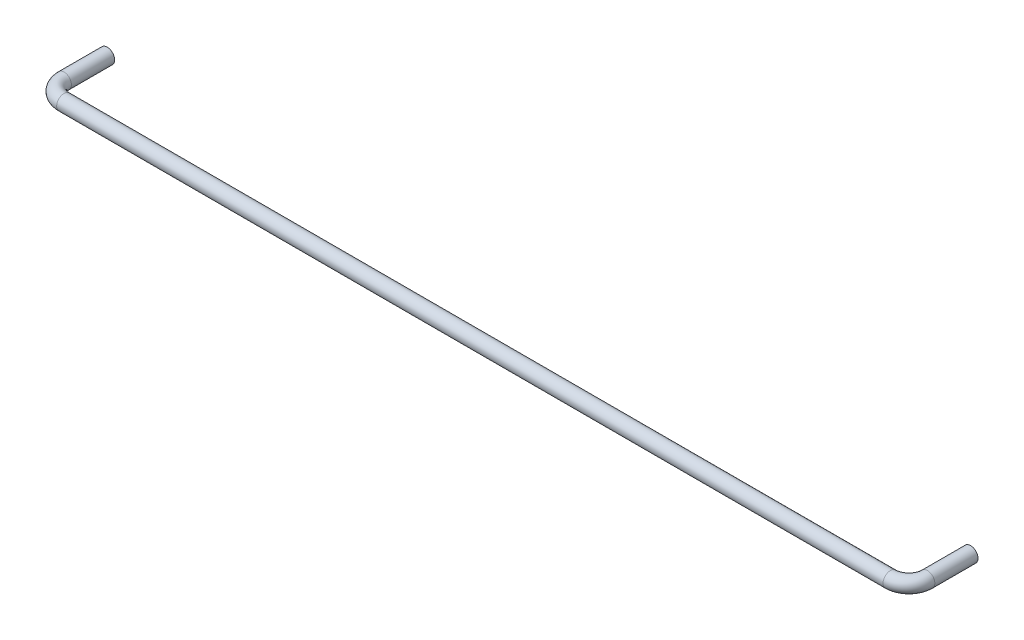
ISO-10303-21;
HEADER;
FILE_DESCRIPTION(('STEP AP214'),'2;1');
FILE_NAME('part.step','',(''),(''),'','','');
FILE_SCHEMA(('AUTOMOTIVE_DESIGN { 1 0 10303 214 1 1 1 1 }'));
ENDSEC;
DATA;
#1=APPLICATION_CONTEXT('core data for automotive mechanical design processes');
#2=APPLICATION_PROTOCOL_DEFINITION('international standard','automotive_design',2000,#1);
#3=PRODUCT_CONTEXT('',#1,'mechanical');
#4=PRODUCT('Part','Part','',(#3));
#5=PRODUCT_RELATED_PRODUCT_CATEGORY('part','',(#4));
#6=PRODUCT_DEFINITION_FORMATION('','',#4);
#7=PRODUCT_DEFINITION_CONTEXT('part definition',#1,'design');
#8=PRODUCT_DEFINITION('design','',#6,#7);
#9=PRODUCT_DEFINITION_SHAPE('','',#8);
#10=(LENGTH_UNIT() NAMED_UNIT(*) SI_UNIT(.MILLI.,.METRE.));
#11=(NAMED_UNIT(*) PLANE_ANGLE_UNIT() SI_UNIT($,.RADIAN.));
#12=(NAMED_UNIT(*) SI_UNIT($,.STERADIAN.) SOLID_ANGLE_UNIT());
#13=UNCERTAINTY_MEASURE_WITH_UNIT(LENGTH_MEASURE(1.E-05),#10,'distance_accuracy_value','');
#14=(GEOMETRIC_REPRESENTATION_CONTEXT(3) GLOBAL_UNCERTAINTY_ASSIGNED_CONTEXT((#13)) GLOBAL_UNIT_ASSIGNED_CONTEXT((#10,
#11,#12)) REPRESENTATION_CONTEXT('',''));
#15=CARTESIAN_POINT('',(0.,0.,0.));
#16=DIRECTION('',(0.,0.,1.));
#17=DIRECTION('',(1.,0.,0.));
#18=AXIS2_PLACEMENT_3D('',#15,#16,#17);
#19=CARTESIAN_POINT('',(70.,0.,0.));
#20=DIRECTION('',(0.,0.,-1.));
#21=DIRECTION('',(-1.,0.,0.));
#22=AXIS2_PLACEMENT_3D('',#19,#20,#21);
#23=PLANE('',#22);
#24=CARTESIAN_POINT('',(70.,0.,0.));
#25=DIRECTION('',(0.,0.,-1.));
#26=DIRECTION('',(-1.,0.,0.));
#27=AXIS2_PLACEMENT_3D('',#24,#25,#26);
#28=CIRCLE('',#27,0.6);
#29=CARTESIAN_POINT('',(69.4,0.,0.));
#30=VERTEX_POINT('',#29);
#31=EDGE_CURVE('E64',#30,#30,#28,.T.);
#32=ORIENTED_EDGE('',*,*,#31,.T.);
#33=EDGE_LOOP('',(#32));
#34=FACE_BOUND('',#33,.T.);
#35=ADVANCED_FACE('F37',(#34),#23,.T.);
#36=CARTESIAN_POINT('',(0.,0.,0.));
#37=DIRECTION('',(0.,0.,1.));
#38=DIRECTION('',(1.,0.,0.));
#39=AXIS2_PLACEMENT_3D('',#36,#37,#38);
#40=PLANE('',#39);
#41=CARTESIAN_POINT('',(0.,0.,0.));
#42=DIRECTION('',(0.,0.,1.));
#43=DIRECTION('',(1.,0.,0.));
#44=AXIS2_PLACEMENT_3D('',#41,#42,#43);
#45=CIRCLE('',#44,0.6);
#46=CARTESIAN_POINT('',(0.6,0.,0.));
#47=VERTEX_POINT('',#46);
#48=EDGE_CURVE('E10',#47,#47,#45,.T.);
#49=ORIENTED_EDGE('',*,*,#48,.F.);
#50=EDGE_LOOP('',(#49));
#51=FACE_BOUND('',#50,.T.);
#52=ADVANCED_FACE('F73',(#51),#40,.F.);
#53=CARTESIAN_POINT('',(70.,0.,0.));
#54=DIRECTION('',(0.,0.,1.));
#55=DIRECTION('',(1.,0.,0.));
#56=AXIS2_PLACEMENT_3D('',#53,#54,#55);
#57=CYLINDRICAL_SURFACE('',#56,0.6);
#58=CARTESIAN_POINT('',(70.,0.,3.49999999999999));
#59=DIRECTION('',(0.,0.,-1.));
#60=DIRECTION('',(-1.,0.,0.));
#61=AXIS2_PLACEMENT_3D('',#58,#59,#60);
#62=CIRCLE('',#61,0.6);
#63=CARTESIAN_POINT('',(70.6,0.,3.49999999999999));
#64=VERTEX_POINT('',#63);
#65=EDGE_CURVE('E60',#64,#64,#62,.T.);
#66=ORIENTED_EDGE('',*,*,#65,.T.);
#67=EDGE_LOOP('',(#66));
#68=FACE_BOUND('',#67,.T.);
#69=ORIENTED_EDGE('',*,*,#31,.F.);
#70=EDGE_LOOP('',(#69));
#71=FACE_BOUND('',#70,.T.);
#72=ADVANCED_FACE('F70',(#68,#71),#57,.T.);
#73=CARTESIAN_POINT('',(68.5,0.,3.5));
#74=DIRECTION('',(0.,-1.,0.));
#75=DIRECTION('',(0.,0.,-1.));
#76=AXIS2_PLACEMENT_3D('',#73,#74,#75);
#77=TOROIDAL_SURFACE('',#76,1.5,0.6);
#78=CARTESIAN_POINT('',(68.5,0.,5.));
#79=DIRECTION('',(1.,0.,0.));
#80=DIRECTION('',(0.,0.,-1.));
#81=AXIS2_PLACEMENT_3D('',#78,#79,#80);
#82=CIRCLE('',#81,0.6);
#83=CARTESIAN_POINT('',(68.5,0.,5.6));
#84=VERTEX_POINT('',#83);
#85=EDGE_CURVE('E54',#84,#84,#82,.T.);
#86=CARTESIAN_POINT('',(68.5,0.,3.5));
#87=DIRECTION('',(0.,-1.,0.));
#88=DIRECTION('',(0.,0.,-1.));
#89=AXIS2_PLACEMENT_3D('',#86,#87,#88);
#90=CIRCLE('',#89,2.1);
#91=EDGE_CURVE('',#64,#84,#90,.T.);
#92=ORIENTED_EDGE('',*,*,#65,.F.);
#93=ORIENTED_EDGE('',*,*,#85,.T.);
#94=ORIENTED_EDGE('',*,*,#91,.T.);
#95=ORIENTED_EDGE('',*,*,#91,.F.);
#96=EDGE_LOOP('',(#92,#94,#93,#95));
#97=FACE_BOUND('',#96,.T.);
#98=ADVANCED_FACE('F72',(#97),#77,.T.);
#99=CARTESIAN_POINT('',(68.5,0.,5.));
#100=DIRECTION('',(-1.,0.,0.));
#101=DIRECTION('',(0.,0.,1.));
#102=AXIS2_PLACEMENT_3D('',#99,#100,#101);
#103=CYLINDRICAL_SURFACE('',#102,0.6);
#104=CARTESIAN_POINT('',(1.50000000000001,0.,5.));
#105=DIRECTION('',(1.,0.,0.));
#106=DIRECTION('',(0.,0.,-1.));
#107=AXIS2_PLACEMENT_3D('',#104,#105,#106);
#108=CIRCLE('',#107,0.6);
#109=CARTESIAN_POINT('',(1.50000000000001,0.,5.6));
#110=VERTEX_POINT('',#109);
#111=EDGE_CURVE('E49',#110,#110,#108,.T.);
#112=ORIENTED_EDGE('',*,*,#111,.T.);
#113=EDGE_LOOP('',(#112));
#114=FACE_BOUND('',#113,.T.);
#115=ORIENTED_EDGE('',*,*,#85,.F.);
#116=EDGE_LOOP('',(#115));
#117=FACE_BOUND('',#116,.T.);
#118=ADVANCED_FACE('F80',(#114,#117),#103,.T.);
#119=CARTESIAN_POINT('',(1.5,0.,3.5));
#120=DIRECTION('',(0.,-1.,0.));
#121=DIRECTION('',(0.,0.,-1.));
#122=AXIS2_PLACEMENT_3D('',#119,#120,#121);
#123=TOROIDAL_SURFACE('',#122,1.5,0.6);
#124=CARTESIAN_POINT('',(0.,0.,3.49999999999999));
#125=DIRECTION('',(0.,0.,1.));
#126=DIRECTION('',(1.,0.,0.));
#127=AXIS2_PLACEMENT_3D('',#124,#125,#126);
#128=CIRCLE('',#127,0.6);
#129=CARTESIAN_POINT('',(-0.6,0.,3.49999999999998));
#130=VERTEX_POINT('',#129);
#131=EDGE_CURVE('E44',#130,#130,#128,.T.);
#132=CARTESIAN_POINT('',(1.5,0.,3.5));
#133=DIRECTION('',(0.,-1.,0.));
#134=DIRECTION('',(0.,0.,-1.));
#135=AXIS2_PLACEMENT_3D('',#132,#133,#134);
#136=CIRCLE('',#135,2.1);
#137=EDGE_CURVE('',#110,#130,#136,.T.);
#138=ORIENTED_EDGE('',*,*,#111,.F.);
#139=ORIENTED_EDGE('',*,*,#131,.T.);
#140=ORIENTED_EDGE('',*,*,#137,.T.);
#141=ORIENTED_EDGE('',*,*,#137,.F.);
#142=EDGE_LOOP('',(#138,#140,#139,#141));
#143=FACE_BOUND('',#142,.T.);
#144=ADVANCED_FACE('F86',(#143),#123,.T.);
#145=CARTESIAN_POINT('',(0.,0.,3.49999999999999));
#146=DIRECTION('',(0.,0.,-1.));
#147=DIRECTION('',(-1.,0.,0.));
#148=AXIS2_PLACEMENT_3D('',#145,#146,#147);
#149=CYLINDRICAL_SURFACE('',#148,0.6);
#150=ORIENTED_EDGE('',*,*,#48,.T.);
#151=EDGE_LOOP('',(#150));
#152=FACE_BOUND('',#151,.T.);
#153=ORIENTED_EDGE('',*,*,#131,.F.);
#154=EDGE_LOOP('',(#153));
#155=FACE_BOUND('',#154,.T.);
#156=ADVANCED_FACE('F84',(#152,#155),#149,.T.);
#157=CLOSED_SHELL('',(#35,#52,#72,#98,#118,#144,#156));
#158=MANIFOLD_SOLID_BREP('B2',#157);
#159=ADVANCED_BREP_SHAPE_REPRESENTATION('',(#18,#158),#14);
#160=SHAPE_DEFINITION_REPRESENTATION(#9,#159);
ENDSEC;
END-ISO-10303-21;
